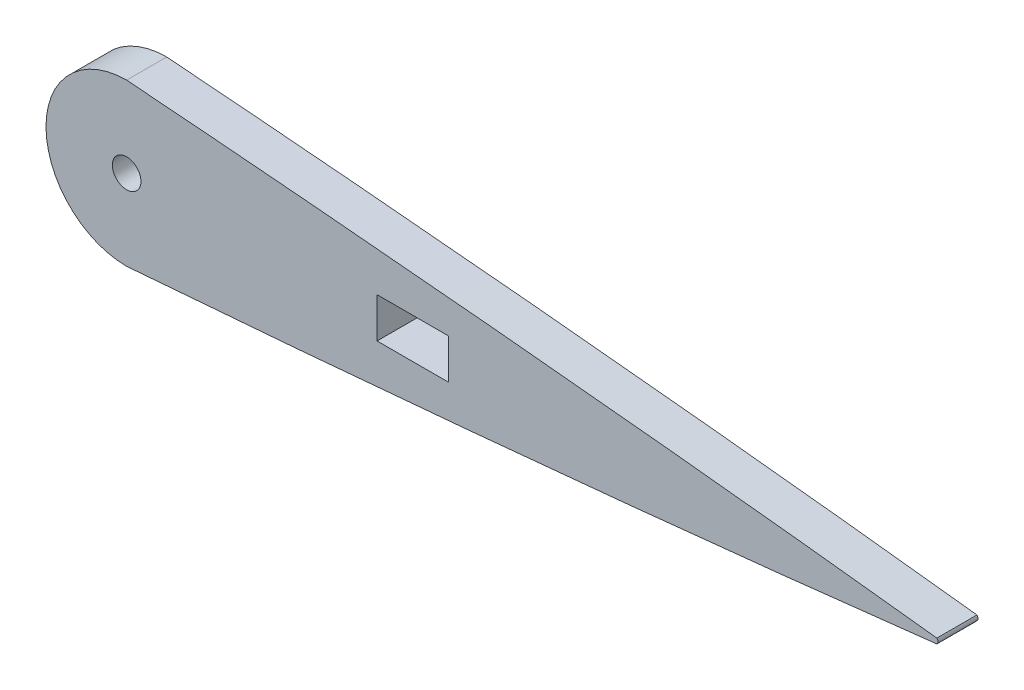
ISO-10303-21;
HEADER;
FILE_DESCRIPTION(('STEP AP214'),'2;1');
FILE_NAME('part.step','',(''),(''),'','','');
FILE_SCHEMA(('AUTOMOTIVE_DESIGN { 1 0 10303 214 1 1 1 1 }'));
ENDSEC;
DATA;
#1=APPLICATION_CONTEXT('core data for automotive mechanical design processes');
#2=APPLICATION_PROTOCOL_DEFINITION('international standard','automotive_design',2000,#1);
#3=PRODUCT_CONTEXT('',#1,'mechanical');
#4=PRODUCT('Part','Part','',(#3));
#5=PRODUCT_RELATED_PRODUCT_CATEGORY('part','',(#4));
#6=PRODUCT_DEFINITION_FORMATION('','',#4);
#7=PRODUCT_DEFINITION_CONTEXT('part definition',#1,'design');
#8=PRODUCT_DEFINITION('design','',#6,#7);
#9=PRODUCT_DEFINITION_SHAPE('','',#8);
#10=(LENGTH_UNIT() NAMED_UNIT(*) SI_UNIT(.MILLI.,.METRE.));
#11=(NAMED_UNIT(*) PLANE_ANGLE_UNIT() SI_UNIT($,.RADIAN.));
#12=(NAMED_UNIT(*) SI_UNIT($,.STERADIAN.) SOLID_ANGLE_UNIT());
#13=UNCERTAINTY_MEASURE_WITH_UNIT(LENGTH_MEASURE(1.E-05),#10,'distance_accuracy_value','');
#14=(GEOMETRIC_REPRESENTATION_CONTEXT(3) GLOBAL_UNCERTAINTY_ASSIGNED_CONTEXT((#13)) GLOBAL_UNIT_ASSIGNED_CONTEXT((#10,
#11,#12)) REPRESENTATION_CONTEXT('',''));
#15=CARTESIAN_POINT('',(0.,0.,0.));
#16=DIRECTION('',(0.,0.,1.));
#17=DIRECTION('',(1.,0.,0.));
#18=AXIS2_PLACEMENT_3D('',#15,#16,#17);
#19=CARTESIAN_POINT('',(279.8215,0.,1.4));
#20=DIRECTION('',(0.,0.,-1.));
#21=DIRECTION('',(-1.,0.,0.));
#22=AXIS2_PLACEMENT_3D('',#19,#20,#21);
#23=CYLINDRICAL_SURFACE('',#22,0.252437120883675);
#24=CARTESIAN_POINT('',(279.8215,0.,-1.4));
#25=DIRECTION('',(0.,0.,1.));
#26=DIRECTION('',(1.,0.,0.));
#27=AXIS2_PLACEMENT_3D('',#24,#25,#26);
#28=CIRCLE('',#27,0.252437120883675);
#29=CARTESIAN_POINT('',(280.,0.1785,-1.4));
#30=VERTEX_POINT('',#29);
#31=CARTESIAN_POINT('',(280.,-0.1785,-1.4));
#32=VERTEX_POINT('',#31);
#33=EDGE_CURVE('E175',#30,#32,#28,.F.);
#34=ORIENTED_EDGE('',*,*,#33,.F.);
#35=DIRECTION('',(0.,0.,-1.));
#36=VECTOR('',#35,1.);
#37=CARTESIAN_POINT('',(280.,0.1785,1.4));
#38=LINE('',#37,#36);
#39=CARTESIAN_POINT('',(280.,0.1785,1.4));
#40=VERTEX_POINT('',#39);
#41=EDGE_CURVE('E11',#40,#30,#38,.T.);
#42=ORIENTED_EDGE('',*,*,#41,.F.);
#43=CARTESIAN_POINT('',(279.8215,0.,1.4));
#44=DIRECTION('',(0.,0.,1.));
#45=DIRECTION('',(1.,0.,0.));
#46=AXIS2_PLACEMENT_3D('',#43,#44,#45);
#47=CIRCLE('',#46,0.252437120883675);
#48=CARTESIAN_POINT('',(280.,-0.1785,1.4));
#49=VERTEX_POINT('',#48);
#50=EDGE_CURVE('E130',#40,#49,#47,.F.);
#51=ORIENTED_EDGE('',*,*,#50,.T.);
#52=DIRECTION('',(0.,0.,-1.));
#53=VECTOR('',#52,1.);
#54=CARTESIAN_POINT('',(280.,-0.1785,1.4));
#55=LINE('',#54,#53);
#56=EDGE_CURVE('E95',#49,#32,#55,.T.);
#57=ORIENTED_EDGE('',*,*,#56,.T.);
#58=EDGE_LOOP('',(#34,#42,#51,#57));
#59=FACE_BOUND('',#58,.T.);
#60=ADVANCED_FACE('F41',(#59),#23,.T.);
#61=CARTESIAN_POINT('',(280.,0.1785,1.4));
#62=CARTESIAN_POINT('',(279.592043703671,0.226075897783467,1.4));
#63=CARTESIAN_POINT('',(278.452596210234,0.358958360844463,1.4));
#64=CARTESIAN_POINT('',(276.385426802208,0.596436481937331,1.4));
#65=CARTESIAN_POINT('',(273.651166983567,0.905304265461348,1.4));
#66=CARTESIAN_POINT('',(270.455833183168,1.25859090467058,1.4));
#67=CARTESIAN_POINT('',(266.898988861825,1.64260730411104,1.4));
#68=CARTESIAN_POINT('',(263.047743378214,2.04785660385741,1.4));
#69=CARTESIAN_POINT('',(258.952644661846,2.46718813772148,1.4));
#70=CARTESIAN_POINT('',(253.11611192075,3.04786904369115,1.4));
#71=CARTESIAN_POINT('',(247.071089235748,3.62220530992837,1.4));
#72=CARTESIAN_POINT('',(240.854179313273,4.18491264898859,1.4));
#73=CARTESIAN_POINT('',(236.038226964104,4.60581174883637,1.4));
#74=CARTESIAN_POINT('',(231.150377302514,5.0173511026198,1.4));
#75=CARTESIAN_POINT('',(226.209311113549,5.41695826474113,1.4));
#76=CARTESIAN_POINT('',(221.232257466585,5.802244474926,1.4));
#77=CARTESIAN_POINT('',(216.235178286272,6.17086457697306,1.4));
#78=CARTESIAN_POINT('',(211.232977593233,6.52047434958791,1.4));
#79=CARTESIAN_POINT('',(206.239642946259,6.84887299963153,1.4));
#80=CARTESIAN_POINT('',(201.268368916985,7.15382688632495,1.4));
#81=CARTESIAN_POINT('',(196.331634567492,7.43310533690328,1.4));
#82=CARTESIAN_POINT('',(191.441311474098,7.68460443906704,1.4));
#83=CARTESIAN_POINT('',(186.608700126931,7.90621829286941,1.4));
#84=CARTESIAN_POINT('',(181.844626933159,8.09595849303594,1.4));
#85=CARTESIAN_POINT('',(177.159453511195,8.25195768192942,1.4));
#86=CARTESIAN_POINT('',(172.563150271755,8.37248656398387,1.4));
#87=CARTESIAN_POINT('',(168.065295924147,8.45595366245417,1.4));
#88=CARTESIAN_POINT('',(163.675147454163,8.5010026998616,1.4));
#89=CARTESIAN_POINT('',(159.401643403725,8.50652296727326,1.4));
#90=CARTESIAN_POINT('',(155.253439755899,8.47152880790102,1.4));
#91=CARTESIAN_POINT('',(151.238917925322,8.39550607585732,1.4));
#92=CARTESIAN_POINT('',(147.366223919106,8.27798597685019,1.4));
#93=CARTESIAN_POINT('',(143.643266298458,8.11897556141504,1.4));
#94=CARTESIAN_POINT('',(140.077743555427,7.91867894287145,1.4));
#95=CARTESIAN_POINT('',(136.677139412155,7.67760454203032,1.4));
#96=CARTESIAN_POINT('',(133.44876289533,7.39648056861162,1.4));
#97=CARTESIAN_POINT('',(130.399721685833,7.07642431038863,1.4));
#98=CARTESIAN_POINT('',(127.536961088608,6.71865034112428,1.4));
#99=CARTESIAN_POINT('',(124.867245825052,6.32466607739586,1.4));
#100=CARTESIAN_POINT('',(122.397158973637,5.89612056643678,1.4));
#101=CARTESIAN_POINT('',(120.133109351335,5.43479747619412,1.4));
#102=CARTESIAN_POINT('',(118.081312132678,4.94256764101073,1.4));
#103=CARTESIAN_POINT('',(116.247665797811,4.42139238611828,1.4));
#104=CARTESIAN_POINT('',(114.637939719778,3.87306046577258,1.4));
#105=CARTESIAN_POINT('',(113.256788366372,3.29930923783808,1.4));
#106=CARTESIAN_POINT('',(112.109835923497,2.70130638754162,1.4));
#107=CARTESIAN_POINT('',(111.196336340545,2.07855523302877,1.4));
#108=CARTESIAN_POINT('',(110.530223641577,1.42706975809109,1.4));
#109=CARTESIAN_POINT('',(110.085538217979,0.734230220465984,1.4));
#110=CARTESIAN_POINT('',(110.027578175867,0.236721440142773,1.4));
#111=CARTESIAN_POINT('',(110.,0.,1.4));
#112=B_SPLINE_CURVE_WITH_KNOTS('',3,(#61,#62,#63,#64,#65,#66,#67,#68,#69,#70,#71,#72,#73,#74,
#75,#76,#77,#78,#79,#80,#81,#82,#83,#84,#85,#86,#87,#88,#89,#90,#91,#92,#93,#94,#95,#96,#97,#98,
#99,#100,#101,#102,#103,#104,#105,#106,#107,#108,#109,#110,#111),.UNSPECIFIED.,.F.,.F.,(4,1,1,1,
1,1,1,1,1,1,1,1,1,1,1,1,1,1,1,1,1,1,1,1,1,1,1,1,1,1,1,1,1,1,1,1,1,1,1,1,1,1,1,1,1,1,1,1,4),(0.,
0.00714472364101537,0.0199556607345446,0.0361960612227423,0.0550111837630616,0.0758789375062231,
0.0984288660950085,0.122375554002083,0.147487885417653,0.200459747132314,0.228005170188377,
0.256076453638138,0.284555151070125,0.31333276259982,0.342309553949656,0.371392651251454,
0.400495752426115,0.429537687145242,0.458441905920554,0.487136113386761,0.515551917136779,
0.543623846405843,0.571289984327897,0.598490809568145,0.625169613225281,0.651272029103837,
0.676746157949116,0.701541790883913,0.725611016556625,0.74890783507394,0.771387785068823,
0.793008138575143,0.813728032856974,0.833507815357633,0.852309696093785,0.870097310144046,
0.886835918069106,0.902492781713446,0.917037139140432,0.930441053860646,0.942679762162792,
0.953733567025024,0.963589785484808,0.97224701929817,0.979722225388436,0.986065145275041,
0.991385258303778,0.995900988803729,1.),.UNSPECIFIED.);
#113=DIRECTION('',(0.,0.,-1.));
#114=VECTOR('',#113,1.);
#115=SURFACE_OF_LINEAR_EXTRUSION('',#112,#114);
#116=CARTESIAN_POINT('',(280.,0.1785,-1.4));
#117=CARTESIAN_POINT('',(279.592043703671,0.226075897783467,-1.4));
#118=CARTESIAN_POINT('',(278.452596210234,0.358958360844463,-1.4));
#119=CARTESIAN_POINT('',(276.385426802208,0.596436481937331,-1.4));
#120=CARTESIAN_POINT('',(273.651166983567,0.905304265461348,-1.4));
#121=CARTESIAN_POINT('',(270.455833183168,1.25859090467058,-1.4));
#122=CARTESIAN_POINT('',(266.898988861825,1.64260730411104,-1.4));
#123=CARTESIAN_POINT('',(263.047743378214,2.04785660385741,-1.4));
#124=CARTESIAN_POINT('',(258.952644661846,2.46718813772148,-1.4));
#125=CARTESIAN_POINT('',(253.11611192075,3.04786904369115,-1.4));
#126=CARTESIAN_POINT('',(247.071089235748,3.62220530992837,-1.4));
#127=CARTESIAN_POINT('',(240.854179313273,4.18491264898859,-1.4));
#128=CARTESIAN_POINT('',(236.038226964104,4.60581174883637,-1.4));
#129=CARTESIAN_POINT('',(231.150377302514,5.0173511026198,-1.4));
#130=CARTESIAN_POINT('',(226.209311113549,5.41695826474113,-1.4));
#131=CARTESIAN_POINT('',(221.232257466585,5.802244474926,-1.4));
#132=CARTESIAN_POINT('',(216.235178286272,6.17086457697306,-1.4));
#133=CARTESIAN_POINT('',(211.232977593233,6.52047434958791,-1.4));
#134=CARTESIAN_POINT('',(206.239642946259,6.84887299963153,-1.4));
#135=CARTESIAN_POINT('',(201.268368916985,7.15382688632495,-1.4));
#136=CARTESIAN_POINT('',(196.331634567492,7.43310533690328,-1.4));
#137=CARTESIAN_POINT('',(191.441311474098,7.68460443906704,-1.4));
#138=CARTESIAN_POINT('',(186.608700126931,7.90621829286941,-1.4));
#139=CARTESIAN_POINT('',(181.844626933159,8.09595849303594,-1.4));
#140=CARTESIAN_POINT('',(177.159453511195,8.25195768192942,-1.4));
#141=CARTESIAN_POINT('',(172.563150271755,8.37248656398387,-1.4));
#142=CARTESIAN_POINT('',(168.065295924147,8.45595366245417,-1.4));
#143=CARTESIAN_POINT('',(163.675147454163,8.5010026998616,-1.4));
#144=CARTESIAN_POINT('',(159.401643403725,8.50652296727326,-1.4));
#145=CARTESIAN_POINT('',(155.253439755899,8.47152880790102,-1.4));
#146=CARTESIAN_POINT('',(151.238917925322,8.39550607585732,-1.4));
#147=CARTESIAN_POINT('',(147.366223919106,8.27798597685019,-1.4));
#148=CARTESIAN_POINT('',(143.643266298458,8.11897556141504,-1.4));
#149=CARTESIAN_POINT('',(140.077743555427,7.91867894287145,-1.4));
#150=CARTESIAN_POINT('',(136.677139412155,7.67760454203032,-1.4));
#151=CARTESIAN_POINT('',(133.44876289533,7.39648056861162,-1.4));
#152=CARTESIAN_POINT('',(130.399721685833,7.07642431038863,-1.4));
#153=CARTESIAN_POINT('',(127.536961088608,6.71865034112428,-1.4));
#154=CARTESIAN_POINT('',(124.867245825052,6.32466607739586,-1.4));
#155=CARTESIAN_POINT('',(122.397158973637,5.89612056643678,-1.4));
#156=CARTESIAN_POINT('',(120.133109351335,5.43479747619412,-1.4));
#157=CARTESIAN_POINT('',(118.081312132678,4.94256764101073,-1.4));
#158=CARTESIAN_POINT('',(116.247665797811,4.42139238611828,-1.4));
#159=CARTESIAN_POINT('',(114.637939719778,3.87306046577258,-1.4));
#160=CARTESIAN_POINT('',(113.256788366372,3.29930923783808,-1.4));
#161=CARTESIAN_POINT('',(112.109835923497,2.70130638754162,-1.4));
#162=CARTESIAN_POINT('',(111.196336340545,2.07855523302877,-1.4));
#163=CARTESIAN_POINT('',(110.530223641577,1.42706975809109,-1.4));
#164=CARTESIAN_POINT('',(110.085538217979,0.734230220465984,-1.4));
#165=CARTESIAN_POINT('',(110.027578175867,0.236721440142773,-1.4));
#166=CARTESIAN_POINT('',(110.,0.,-1.4));
#167=B_SPLINE_CURVE_WITH_KNOTS('',3,(#116,#117,#118,#119,#120,#121,#122,#123,#124,#125,#126,
#127,#128,#129,#130,#131,#132,#133,#134,#135,#136,#137,#138,#139,#140,#141,#142,#143,#144,#145,
#146,#147,#148,#149,#150,#151,#152,#153,#154,#155,#156,#157,#158,#159,#160,#161,#162,#163,#164,
#165,#166),.UNSPECIFIED.,.F.,.F.,(4,1,1,1,1,1,1,1,1,1,1,1,1,1,1,1,1,1,1,1,1,1,1,1,1,1,1,1,1,1,1,
1,1,1,1,1,1,1,1,1,1,1,1,1,1,1,1,1,4),(0.,0.00714472364101537,0.0199556607345446,
0.0361960612227423,0.0550111837630616,0.0758789375062231,0.0984288660950085,0.122375554002083,
0.147487885417653,0.200459747132314,0.228005170188377,0.256076453638138,0.284555151070125,
0.31333276259982,0.342309553949656,0.371392651251454,0.400495752426115,0.429537687145242,
0.458441905920554,0.487136113386761,0.515551917136779,0.543623846405843,0.571289984327897,
0.598490809568145,0.625169613225281,0.651272029103837,0.676746157949116,0.701541790883913,
0.725611016556625,0.74890783507394,0.771387785068823,0.793008138575143,0.813728032856974,
0.833507815357633,0.852309696093785,0.870097310144046,0.886835918069106,0.902492781713446,
0.917037139140432,0.930441053860646,0.942679762162792,0.953733567025024,0.963589785484808,
0.97224701929817,0.979722225388436,0.986065145275041,0.991385258303778,0.995900988803729,1.),.UNSPECIFIED.);
#168=CARTESIAN_POINT('',(223.382624747256,5.63499062833055,-1.4));
#169=VERTEX_POINT('',#168);
#170=EDGE_CURVE('E136',#30,#169,#167,.T.);
#171=ORIENTED_EDGE('',*,*,#170,.T.);
#172=DIRECTION('',(0.,0.,-1.));
#173=VECTOR('',#172,1.);
#174=CARTESIAN_POINT('',(223.382624747256,5.63499062833055,1.4));
#175=LINE('',#174,#173);
#176=CARTESIAN_POINT('',(223.382624747256,5.63499062833055,1.4));
#177=VERTEX_POINT('',#176);
#178=EDGE_CURVE('E52',#177,#169,#175,.T.);
#179=ORIENTED_EDGE('',*,*,#178,.F.);
#180=EDGE_CURVE('E126',#40,#177,#112,.T.);
#181=ORIENTED_EDGE('',*,*,#180,.F.);
#182=ORIENTED_EDGE('',*,*,#41,.T.);
#183=EDGE_LOOP('',(#171,#179,#181,#182));
#184=FACE_BOUND('',#183,.T.);
#185=ADVANCED_FACE('F134',(#184),#115,.F.);
#186=CARTESIAN_POINT('',(223.382624747265,3.73832909072992E-12,1.4));
#187=DIRECTION('',(0.,0.,-1.));
#188=DIRECTION('',(-1.,0.,0.));
#189=AXIS2_PLACEMENT_3D('',#186,#187,#188);
#190=CYLINDRICAL_SURFACE('',#189,5.63499062832681);
#191=CARTESIAN_POINT('',(223.382624747265,3.73832909072992E-12,-1.4));
#192=DIRECTION('',(0.,0.,1.));
#193=DIRECTION('',(1.,0.,0.));
#194=AXIS2_PLACEMENT_3D('',#191,#192,#193);
#195=CIRCLE('',#194,5.63499062832681);
#196=CARTESIAN_POINT('',(223.382624747256,-5.63499062832307,-1.4));
#197=VERTEX_POINT('',#196);
#198=EDGE_CURVE('E165',#169,#197,#195,.T.);
#199=ORIENTED_EDGE('',*,*,#198,.T.);
#200=DIRECTION('',(0.,0.,-1.));
#201=VECTOR('',#200,1.);
#202=CARTESIAN_POINT('',(223.382624747256,-5.63499062832307,1.4));
#203=LINE('',#202,#201);
#204=CARTESIAN_POINT('',(223.382624747256,-5.63499062832307,1.4));
#205=VERTEX_POINT('',#204);
#206=EDGE_CURVE('E124',#205,#197,#203,.T.);
#207=ORIENTED_EDGE('',*,*,#206,.F.);
#208=CARTESIAN_POINT('',(223.382624747265,3.73832909072992E-12,1.4));
#209=DIRECTION('',(0.,0.,1.));
#210=DIRECTION('',(1.,0.,0.));
#211=AXIS2_PLACEMENT_3D('',#208,#209,#210);
#212=CIRCLE('',#211,5.63499062832681);
#213=EDGE_CURVE('E118',#177,#205,#212,.T.);
#214=ORIENTED_EDGE('',*,*,#213,.F.);
#215=ORIENTED_EDGE('',*,*,#178,.T.);
#216=EDGE_LOOP('',(#199,#207,#214,#215));
#217=FACE_BOUND('',#216,.T.);
#218=ADVANCED_FACE('F121',(#217),#190,.T.);
#219=CARTESIAN_POINT('',(245.882624747265,0.,1.4));
#220=DIRECTION('',(-1.,0.,0.));
#221=DIRECTION('',(0.,0.,1.));
#222=AXIS2_PLACEMENT_3D('',#219,#220,#221);
#223=PLANE('',#222);
#224=DIRECTION('',(0.,1.,0.));
#225=VECTOR('',#224,1.);
#226=CARTESIAN_POINT('',(245.882624747265,0.,-1.4));
#227=LINE('',#226,#225);
#228=CARTESIAN_POINT('',(245.882624747265,-1.4,-1.4));
#229=VERTEX_POINT('',#228);
#230=CARTESIAN_POINT('',(245.882624747265,1.4,-1.4));
#231=VERTEX_POINT('',#230);
#232=EDGE_CURVE('E196',#229,#231,#227,.T.);
#233=ORIENTED_EDGE('',*,*,#232,.F.);
#234=DIRECTION('',(0.,0.,-1.));
#235=VECTOR('',#234,1.);
#236=CARTESIAN_POINT('',(245.882624747265,-1.4,1.4));
#237=LINE('',#236,#235);
#238=CARTESIAN_POINT('',(245.882624747265,-1.4,1.4));
#239=VERTEX_POINT('',#238);
#240=EDGE_CURVE('E45',#239,#229,#237,.T.);
#241=ORIENTED_EDGE('',*,*,#240,.F.);
#242=DIRECTION('',(0.,1.,0.));
#243=VECTOR('',#242,1.);
#244=CARTESIAN_POINT('',(245.882624747265,0.,1.4));
#245=LINE('',#244,#243);
#246=CARTESIAN_POINT('',(245.882624747265,1.4,1.4));
#247=VERTEX_POINT('',#246);
#248=EDGE_CURVE('E164',#239,#247,#245,.T.);
#249=ORIENTED_EDGE('',*,*,#248,.T.);
#250=DIRECTION('',(0.,0.,-1.));
#251=VECTOR('',#250,1.);
#252=CARTESIAN_POINT('',(245.882624747265,1.4,1.4));
#253=LINE('',#252,#251);
#254=EDGE_CURVE('E143',#247,#231,#253,.T.);
#255=ORIENTED_EDGE('',*,*,#254,.T.);
#256=EDGE_LOOP('',(#233,#241,#249,#255));
#257=FACE_BOUND('',#256,.T.);
#258=ADVANCED_FACE('F43',(#257),#223,.T.);
#259=CARTESIAN_POINT('',(0.,-1.4,1.4));
#260=DIRECTION('',(0.,1.,0.));
#261=DIRECTION('',(0.,0.,1.));
#262=AXIS2_PLACEMENT_3D('',#259,#260,#261);
#263=PLANE('',#262);
#264=DIRECTION('',(1.,0.,0.));
#265=VECTOR('',#264,1.);
#266=CARTESIAN_POINT('',(0.,-1.4,-1.4));
#267=LINE('',#266,#265);
#268=CARTESIAN_POINT('',(240.882624747265,-1.4,-1.4));
#269=VERTEX_POINT('',#268);
#270=EDGE_CURVE('E192',#269,#229,#267,.T.);
#271=ORIENTED_EDGE('',*,*,#270,.F.);
#272=DIRECTION('',(0.,0.,-1.));
#273=VECTOR('',#272,1.);
#274=CARTESIAN_POINT('',(240.882624747265,-1.4,1.4));
#275=LINE('',#274,#273);
#276=CARTESIAN_POINT('',(240.882624747265,-1.4,1.4));
#277=VERTEX_POINT('',#276);
#278=EDGE_CURVE('E149',#277,#269,#275,.T.);
#279=ORIENTED_EDGE('',*,*,#278,.F.);
#280=DIRECTION('',(1.,0.,0.));
#281=VECTOR('',#280,1.);
#282=CARTESIAN_POINT('',(0.,-1.4,1.4));
#283=LINE('',#282,#281);
#284=EDGE_CURVE('E240',#277,#239,#283,.T.);
#285=ORIENTED_EDGE('',*,*,#284,.T.);
#286=ORIENTED_EDGE('',*,*,#240,.T.);
#287=EDGE_LOOP('',(#271,#279,#285,#286));
#288=FACE_BOUND('',#287,.T.);
#289=ADVANCED_FACE('F249',(#288),#263,.T.);
#290=CARTESIAN_POINT('',(240.882624747265,0.,1.4));
#291=DIRECTION('',(-1.,0.,0.));
#292=DIRECTION('',(0.,0.,1.));
#293=AXIS2_PLACEMENT_3D('',#290,#291,#292);
#294=PLANE('',#293);
#295=DIRECTION('',(0.,1.,0.));
#296=VECTOR('',#295,1.);
#297=CARTESIAN_POINT('',(240.882624747265,0.,-1.4));
#298=LINE('',#297,#296);
#299=CARTESIAN_POINT('',(240.882624747265,1.4,-1.4));
#300=VERTEX_POINT('',#299);
#301=EDGE_CURVE('E189',#269,#300,#298,.T.);
#302=ORIENTED_EDGE('',*,*,#301,.T.);
#303=DIRECTION('',(0.,0.,-1.));
#304=VECTOR('',#303,1.);
#305=CARTESIAN_POINT('',(240.882624747265,1.4,1.4));
#306=LINE('',#305,#304);
#307=CARTESIAN_POINT('',(240.882624747265,1.4,1.4));
#308=VERTEX_POINT('',#307);
#309=EDGE_CURVE('E146',#308,#300,#306,.T.);
#310=ORIENTED_EDGE('',*,*,#309,.F.);
#311=DIRECTION('',(0.,1.,0.));
#312=VECTOR('',#311,1.);
#313=CARTESIAN_POINT('',(240.882624747265,0.,1.4));
#314=LINE('',#313,#312);
#315=EDGE_CURVE('E237',#277,#308,#314,.T.);
#316=ORIENTED_EDGE('',*,*,#315,.F.);
#317=ORIENTED_EDGE('',*,*,#278,.T.);
#318=EDGE_LOOP('',(#302,#310,#316,#317));
#319=FACE_BOUND('',#318,.T.);
#320=ADVANCED_FACE('F251',(#319),#294,.F.);
#321=CARTESIAN_POINT('',(223.382624747265,3.73832909072992E-12,1.4));
#322=DIRECTION('',(0.,0.,-1.));
#323=DIRECTION('',(-1.,0.,0.));
#324=AXIS2_PLACEMENT_3D('',#321,#322,#323);
#325=CYLINDRICAL_SURFACE('',#324,0.999999999999998);
#326=CARTESIAN_POINT('',(223.382624747265,3.73832909072992E-12,1.4));
#327=DIRECTION('',(0.,0.,1.));
#328=DIRECTION('',(1.,0.,0.));
#329=AXIS2_PLACEMENT_3D('',#326,#327,#328);
#330=CIRCLE('',#329,0.999999999999998);
#331=CARTESIAN_POINT('',(224.382624747265,3.73832909072992E-12,1.4));
#332=VERTEX_POINT('',#331);
#333=EDGE_CURVE('E230',#332,#332,#330,.T.);
#334=ORIENTED_EDGE('',*,*,#333,.T.);
#335=EDGE_LOOP('',(#334));
#336=FACE_BOUND('',#335,.T.);
#337=CARTESIAN_POINT('',(223.382624747265,3.73832909072992E-12,-1.4));
#338=DIRECTION('',(0.,0.,1.));
#339=DIRECTION('',(1.,0.,0.));
#340=AXIS2_PLACEMENT_3D('',#337,#338,#339);
#341=CIRCLE('',#340,0.999999999999998);
#342=CARTESIAN_POINT('',(224.382624747265,3.73832909072992E-12,-1.4));
#343=VERTEX_POINT('',#342);
#344=EDGE_CURVE('E181',#343,#343,#341,.T.);
#345=ORIENTED_EDGE('',*,*,#344,.F.);
#346=EDGE_LOOP('',(#345));
#347=FACE_BOUND('',#346,.T.);
#348=ADVANCED_FACE('F285',(#336,#347),#325,.F.);
#349=CARTESIAN_POINT('',(0.,1.4,1.4));
#350=DIRECTION('',(0.,1.,0.));
#351=DIRECTION('',(0.,0.,1.));
#352=AXIS2_PLACEMENT_3D('',#349,#350,#351);
#353=PLANE('',#352);
#354=DIRECTION('',(1.,0.,0.));
#355=VECTOR('',#354,1.);
#356=CARTESIAN_POINT('',(0.,1.4,-1.4));
#357=LINE('',#356,#355);
#358=EDGE_CURVE('E185',#300,#231,#357,.T.);
#359=ORIENTED_EDGE('',*,*,#358,.T.);
#360=ORIENTED_EDGE('',*,*,#254,.F.);
#361=DIRECTION('',(1.,0.,0.));
#362=VECTOR('',#361,1.);
#363=CARTESIAN_POINT('',(0.,1.4,1.4));
#364=LINE('',#363,#362);
#365=EDGE_CURVE('E234',#308,#247,#364,.T.);
#366=ORIENTED_EDGE('',*,*,#365,.F.);
#367=ORIENTED_EDGE('',*,*,#309,.T.);
#368=EDGE_LOOP('',(#359,#360,#366,#367));
#369=FACE_BOUND('',#368,.T.);
#370=ADVANCED_FACE('F212',(#369),#353,.F.);
#371=CARTESIAN_POINT('',(110.,0.,1.4));
#372=CARTESIAN_POINT('',(110.027578175867,-0.236721440142772,1.4));
#373=CARTESIAN_POINT('',(110.085538217979,-0.734230220465975,1.4));
#374=CARTESIAN_POINT('',(110.530223641577,-1.42706975809109,1.4));
#375=CARTESIAN_POINT('',(111.196336340545,-2.07855523302878,1.4));
#376=CARTESIAN_POINT('',(112.109835923497,-2.70130638754161,1.4));
#377=CARTESIAN_POINT('',(113.256788366372,-3.29930923783809,1.4));
#378=CARTESIAN_POINT('',(114.637939719778,-3.87306046577258,1.4));
#379=CARTESIAN_POINT('',(116.24766579781,-4.42139238611828,1.4));
#380=CARTESIAN_POINT('',(118.081312132678,-4.94256764101073,1.4));
#381=CARTESIAN_POINT('',(120.133109351335,-5.43479747619412,1.4));
#382=CARTESIAN_POINT('',(122.397158973637,-5.89612056643677,1.4));
#383=CARTESIAN_POINT('',(124.867245825052,-6.32466607739586,1.4));
#384=CARTESIAN_POINT('',(127.536961088608,-6.71865034112428,1.4));
#385=CARTESIAN_POINT('',(130.399721685833,-7.07642431038863,1.4));
#386=CARTESIAN_POINT('',(133.44876289533,-7.39648056861162,1.4));
#387=CARTESIAN_POINT('',(136.677139412155,-7.67760454203032,1.4));
#388=CARTESIAN_POINT('',(140.077743555427,-7.91867894287145,1.4));
#389=CARTESIAN_POINT('',(143.643266298458,-8.11897556141504,1.4));
#390=CARTESIAN_POINT('',(147.366223919106,-8.27798597685019,1.4));
#391=CARTESIAN_POINT('',(151.238917925322,-8.39550607585732,1.4));
#392=CARTESIAN_POINT('',(155.253439755899,-8.47152880790102,1.4));
#393=CARTESIAN_POINT('',(159.401643403725,-8.50652296727325,1.4));
#394=CARTESIAN_POINT('',(163.675147454163,-8.5010026998616,1.4));
#395=CARTESIAN_POINT('',(168.065295924147,-8.45595366245417,1.4));
#396=CARTESIAN_POINT('',(172.563150271755,-8.37248656398386,1.4));
#397=CARTESIAN_POINT('',(177.159453511195,-8.25195768192942,1.4));
#398=CARTESIAN_POINT('',(181.844626933159,-8.09595849303594,1.4));
#399=CARTESIAN_POINT('',(186.60870012693,-7.90621829286941,1.4));
#400=CARTESIAN_POINT('',(191.441311474098,-7.68460443906704,1.4));
#401=CARTESIAN_POINT('',(196.331634567492,-7.43310533690328,1.4));
#402=CARTESIAN_POINT('',(201.268368916985,-7.15382688632495,1.4));
#403=CARTESIAN_POINT('',(206.239642946259,-6.84887299963153,1.4));
#404=CARTESIAN_POINT('',(211.232977593233,-6.52047434958792,1.4));
#405=CARTESIAN_POINT('',(216.235178286271,-6.17086457697306,1.4));
#406=CARTESIAN_POINT('',(221.232257466585,-5.802244474926,1.4));
#407=CARTESIAN_POINT('',(226.209311113548,-5.41695826474113,1.4));
#408=CARTESIAN_POINT('',(231.150377302515,-5.0173511026198,1.4));
#409=CARTESIAN_POINT('',(236.038226964104,-4.60581174883637,1.4));
#410=CARTESIAN_POINT('',(240.854179313273,-4.18491264898859,1.4));
#411=CARTESIAN_POINT('',(247.071089235748,-3.62220530992837,1.4));
#412=CARTESIAN_POINT('',(253.11611192075,-3.04786904369115,1.4));
#413=CARTESIAN_POINT('',(258.952644661846,-2.46718813772147,1.4));
#414=CARTESIAN_POINT('',(263.047743378214,-2.04785660385741,1.4));
#415=CARTESIAN_POINT('',(266.898988861825,-1.64260730411104,1.4));
#416=CARTESIAN_POINT('',(270.455833183168,-1.25859090467058,1.4));
#417=CARTESIAN_POINT('',(273.651166983567,-0.905304265461349,1.4));
#418=CARTESIAN_POINT('',(276.385426802208,-0.59643648193733,1.4));
#419=CARTESIAN_POINT('',(278.452596210234,-0.358958360844466,1.4));
#420=CARTESIAN_POINT('',(279.592043703671,-0.226075897783468,1.4));
#421=CARTESIAN_POINT('',(280.,-0.1785,1.4));
#422=B_SPLINE_CURVE_WITH_KNOTS('',3,(#371,#372,#373,#374,#375,#376,#377,#378,#379,#380,#381,
#382,#383,#384,#385,#386,#387,#388,#389,#390,#391,#392,#393,#394,#395,#396,#397,#398,#399,#400,
#401,#402,#403,#404,#405,#406,#407,#408,#409,#410,#411,#412,#413,#414,#415,#416,#417,#418,#419,
#420,#421),.UNSPECIFIED.,.F.,.F.,(4,1,1,1,1,1,1,1,1,1,1,1,1,1,1,1,1,1,1,1,1,1,1,1,1,1,1,1,1,1,1,
1,1,1,1,1,1,1,1,1,1,1,1,1,1,1,1,1,4),(0.,0.00409901119627066,0.00861474169622249,
0.013934854724959,0.0202777746115639,0.0277529807018305,0.0364102145151919,0.0462664329749759,
0.057320237837208,0.0695589461393541,0.0829628608595683,0.0975072182865541,0.113164081930894,
0.129902689855954,0.147690303906216,0.166492184642367,0.186271967143026,0.206991861424858,
0.228612214931177,0.25109216492606,0.274388983443375,0.298458209116087,0.323253842050884,
0.348727970896163,0.374830386774719,0.401509190431855,0.428710015672103,0.456376153594157,
0.484448082863221,0.512863886613239,0.541558094079446,0.570462312854758,0.599504247573885,
0.628607348748546,0.657690446050344,0.68666723740018,0.715444848929875,0.743923546361862,
0.771994829811623,0.799540252867686,0.852512114582347,0.877624445997917,0.901571133904992,
0.924121062493777,0.944988816236938,0.963803938777258,0.980044339265455,0.992855276358985,1.),.UNSPECIFIED.);
#423=DIRECTION('',(0.,0.,-1.));
#424=VECTOR('',#423,1.);
#425=SURFACE_OF_LINEAR_EXTRUSION('',#422,#424);
#426=CARTESIAN_POINT('',(110.,0.,-1.4));
#427=CARTESIAN_POINT('',(110.027578175867,-0.236721440142772,-1.4));
#428=CARTESIAN_POINT('',(110.085538217979,-0.734230220465975,-1.4));
#429=CARTESIAN_POINT('',(110.530223641577,-1.42706975809109,-1.4));
#430=CARTESIAN_POINT('',(111.196336340545,-2.07855523302878,-1.4));
#431=CARTESIAN_POINT('',(112.109835923497,-2.70130638754161,-1.4));
#432=CARTESIAN_POINT('',(113.256788366372,-3.29930923783809,-1.4));
#433=CARTESIAN_POINT('',(114.637939719778,-3.87306046577258,-1.4));
#434=CARTESIAN_POINT('',(116.24766579781,-4.42139238611828,-1.4));
#435=CARTESIAN_POINT('',(118.081312132678,-4.94256764101073,-1.4));
#436=CARTESIAN_POINT('',(120.133109351335,-5.43479747619412,-1.4));
#437=CARTESIAN_POINT('',(122.397158973637,-5.89612056643677,-1.4));
#438=CARTESIAN_POINT('',(124.867245825052,-6.32466607739586,-1.4));
#439=CARTESIAN_POINT('',(127.536961088608,-6.71865034112428,-1.4));
#440=CARTESIAN_POINT('',(130.399721685833,-7.07642431038863,-1.4));
#441=CARTESIAN_POINT('',(133.44876289533,-7.39648056861162,-1.4));
#442=CARTESIAN_POINT('',(136.677139412155,-7.67760454203032,-1.4));
#443=CARTESIAN_POINT('',(140.077743555427,-7.91867894287145,-1.4));
#444=CARTESIAN_POINT('',(143.643266298458,-8.11897556141504,-1.4));
#445=CARTESIAN_POINT('',(147.366223919106,-8.27798597685019,-1.4));
#446=CARTESIAN_POINT('',(151.238917925322,-8.39550607585732,-1.4));
#447=CARTESIAN_POINT('',(155.253439755899,-8.47152880790102,-1.4));
#448=CARTESIAN_POINT('',(159.401643403725,-8.50652296727325,-1.4));
#449=CARTESIAN_POINT('',(163.675147454163,-8.5010026998616,-1.4));
#450=CARTESIAN_POINT('',(168.065295924147,-8.45595366245417,-1.4));
#451=CARTESIAN_POINT('',(172.563150271755,-8.37248656398386,-1.4));
#452=CARTESIAN_POINT('',(177.159453511195,-8.25195768192942,-1.4));
#453=CARTESIAN_POINT('',(181.844626933159,-8.09595849303594,-1.4));
#454=CARTESIAN_POINT('',(186.60870012693,-7.90621829286941,-1.4));
#455=CARTESIAN_POINT('',(191.441311474098,-7.68460443906704,-1.4));
#456=CARTESIAN_POINT('',(196.331634567492,-7.43310533690328,-1.4));
#457=CARTESIAN_POINT('',(201.268368916985,-7.15382688632495,-1.4));
#458=CARTESIAN_POINT('',(206.239642946259,-6.84887299963153,-1.4));
#459=CARTESIAN_POINT('',(211.232977593233,-6.52047434958792,-1.4));
#460=CARTESIAN_POINT('',(216.235178286271,-6.17086457697306,-1.4));
#461=CARTESIAN_POINT('',(221.232257466585,-5.802244474926,-1.4));
#462=CARTESIAN_POINT('',(226.209311113548,-5.41695826474113,-1.4));
#463=CARTESIAN_POINT('',(231.150377302515,-5.0173511026198,-1.4));
#464=CARTESIAN_POINT('',(236.038226964104,-4.60581174883637,-1.4));
#465=CARTESIAN_POINT('',(240.854179313273,-4.18491264898859,-1.4));
#466=CARTESIAN_POINT('',(247.071089235748,-3.62220530992837,-1.4));
#467=CARTESIAN_POINT('',(253.11611192075,-3.04786904369115,-1.4));
#468=CARTESIAN_POINT('',(258.952644661846,-2.46718813772147,-1.4));
#469=CARTESIAN_POINT('',(263.047743378214,-2.04785660385741,-1.4));
#470=CARTESIAN_POINT('',(266.898988861825,-1.64260730411104,-1.4));
#471=CARTESIAN_POINT('',(270.455833183168,-1.25859090467058,-1.4));
#472=CARTESIAN_POINT('',(273.651166983567,-0.905304265461349,-1.4));
#473=CARTESIAN_POINT('',(276.385426802208,-0.59643648193733,-1.4));
#474=CARTESIAN_POINT('',(278.452596210234,-0.358958360844466,-1.4));
#475=CARTESIAN_POINT('',(279.592043703671,-0.226075897783468,-1.4));
#476=CARTESIAN_POINT('',(280.,-0.1785,-1.4));
#477=B_SPLINE_CURVE_WITH_KNOTS('',3,(#426,#427,#428,#429,#430,#431,#432,#433,#434,#435,#436,
#437,#438,#439,#440,#441,#442,#443,#444,#445,#446,#447,#448,#449,#450,#451,#452,#453,#454,#455,
#456,#457,#458,#459,#460,#461,#462,#463,#464,#465,#466,#467,#468,#469,#470,#471,#472,#473,#474,
#475,#476),.UNSPECIFIED.,.F.,.F.,(4,1,1,1,1,1,1,1,1,1,1,1,1,1,1,1,1,1,1,1,1,1,1,1,1,1,1,1,1,1,1,
1,1,1,1,1,1,1,1,1,1,1,1,1,1,1,1,1,4),(0.,0.00409901119627066,0.00861474169622249,
0.013934854724959,0.0202777746115639,0.0277529807018305,0.0364102145151919,0.0462664329749759,
0.057320237837208,0.0695589461393541,0.0829628608595683,0.0975072182865541,0.113164081930894,
0.129902689855954,0.147690303906216,0.166492184642367,0.186271967143026,0.206991861424858,
0.228612214931177,0.25109216492606,0.274388983443375,0.298458209116087,0.323253842050884,
0.348727970896163,0.374830386774719,0.401509190431855,0.428710015672103,0.456376153594157,
0.484448082863221,0.512863886613239,0.541558094079446,0.570462312854758,0.599504247573885,
0.628607348748546,0.657690446050344,0.68666723740018,0.715444848929875,0.743923546361862,
0.771994829811623,0.799540252867686,0.852512114582347,0.877624445997917,0.901571133904992,
0.924121062493777,0.944988816236938,0.963803938777258,0.980044339265455,0.992855276358985,1.),.UNSPECIFIED.);
#478=EDGE_CURVE('E88',#197,#32,#477,.T.);
#479=ORIENTED_EDGE('',*,*,#478,.T.);
#480=ORIENTED_EDGE('',*,*,#56,.F.);
#481=EDGE_CURVE('E61',#205,#49,#422,.T.);
#482=ORIENTED_EDGE('',*,*,#481,.F.);
#483=ORIENTED_EDGE('',*,*,#206,.T.);
#484=EDGE_LOOP('',(#479,#480,#482,#483));
#485=FACE_BOUND('',#484,.T.);
#486=ADVANCED_FACE('F208',(#485),#425,.F.);
#487=CARTESIAN_POINT('',(0.,0.,1.4));
#488=DIRECTION('',(0.,0.,1.));
#489=DIRECTION('',(1.,0.,0.));
#490=AXIS2_PLACEMENT_3D('',#487,#488,#489);
#491=PLANE('',#490);
#492=ORIENTED_EDGE('',*,*,#248,.F.);
#493=ORIENTED_EDGE('',*,*,#284,.F.);
#494=ORIENTED_EDGE('',*,*,#315,.T.);
#495=ORIENTED_EDGE('',*,*,#365,.T.);
#496=EDGE_LOOP('',(#492,#493,#494,#495));
#497=FACE_BOUND('',#496,.T.);
#498=ORIENTED_EDGE('',*,*,#333,.F.);
#499=EDGE_LOOP('',(#498));
#500=FACE_BOUND('',#499,.T.);
#501=ORIENTED_EDGE('',*,*,#50,.F.);
#502=ORIENTED_EDGE('',*,*,#180,.T.);
#503=ORIENTED_EDGE('',*,*,#213,.T.);
#504=ORIENTED_EDGE('',*,*,#481,.T.);
#505=EDGE_LOOP('',(#501,#502,#503,#504));
#506=FACE_BOUND('',#505,.T.);
#507=ADVANCED_FACE('F129',(#497,#500,#506),#491,.T.);
#508=CARTESIAN_POINT('',(0.,0.,-1.4));
#509=DIRECTION('',(0.,0.,1.));
#510=DIRECTION('',(1.,0.,0.));
#511=AXIS2_PLACEMENT_3D('',#508,#509,#510);
#512=PLANE('',#511);
#513=ORIENTED_EDGE('',*,*,#232,.T.);
#514=ORIENTED_EDGE('',*,*,#358,.F.);
#515=ORIENTED_EDGE('',*,*,#301,.F.);
#516=ORIENTED_EDGE('',*,*,#270,.T.);
#517=EDGE_LOOP('',(#513,#514,#515,#516));
#518=FACE_BOUND('',#517,.T.);
#519=ORIENTED_EDGE('',*,*,#344,.T.);
#520=EDGE_LOOP('',(#519));
#521=FACE_BOUND('',#520,.T.);
#522=ORIENTED_EDGE('',*,*,#33,.T.);
#523=ORIENTED_EDGE('',*,*,#478,.F.);
#524=ORIENTED_EDGE('',*,*,#198,.F.);
#525=ORIENTED_EDGE('',*,*,#170,.F.);
#526=EDGE_LOOP('',(#522,#523,#524,#525));
#527=FACE_BOUND('',#526,.T.);
#528=ADVANCED_FACE('F214',(#518,#521,#527),#512,.F.);
#529=CLOSED_SHELL('',(#60,#185,#218,#258,#289,#320,#348,#370,#486,#507,#528));
#530=MANIFOLD_SOLID_BREP('B2',#529);
#531=ADVANCED_BREP_SHAPE_REPRESENTATION('',(#18,#530),#14);
#532=SHAPE_DEFINITION_REPRESENTATION(#9,#531);
ENDSEC;
END-ISO-10303-21;
